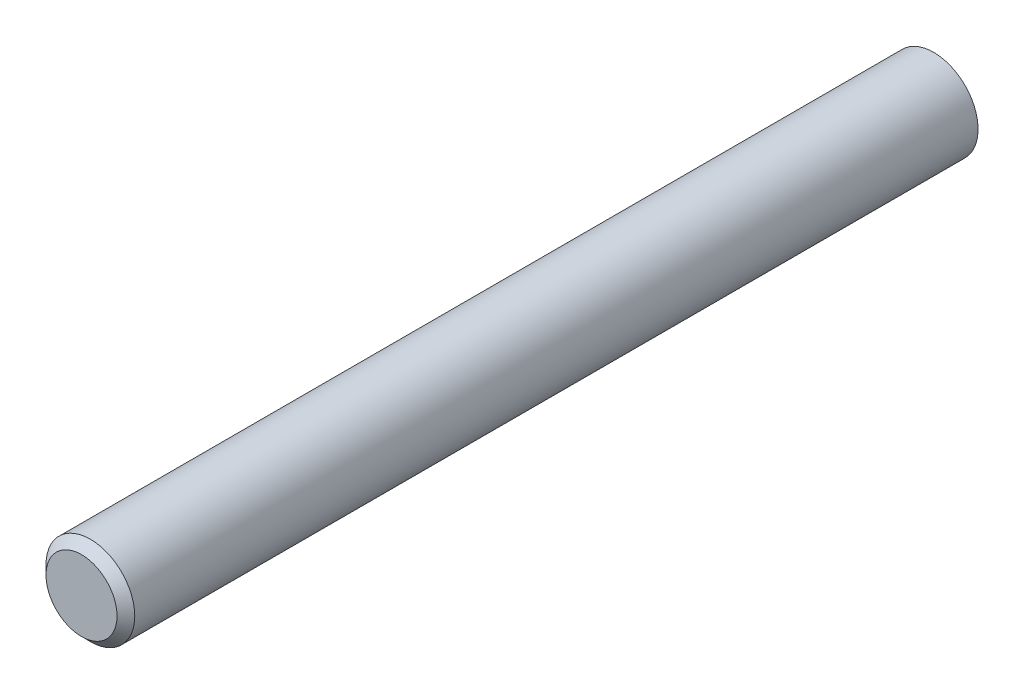
ISO-10303-21;
HEADER;
FILE_DESCRIPTION(('STEP AP214'),'2;1');
FILE_NAME('part.step','',(''),(''),'','','');
FILE_SCHEMA(('AUTOMOTIVE_DESIGN { 1 0 10303 214 1 1 1 1 }'));
ENDSEC;
DATA;
#1=APPLICATION_CONTEXT('core data for automotive mechanical design processes');
#2=APPLICATION_PROTOCOL_DEFINITION('international standard','automotive_design',2000,#1);
#3=PRODUCT_CONTEXT('',#1,'mechanical');
#4=PRODUCT('Part','Part','',(#3));
#5=PRODUCT_RELATED_PRODUCT_CATEGORY('part','',(#4));
#6=PRODUCT_DEFINITION_FORMATION('','',#4);
#7=PRODUCT_DEFINITION_CONTEXT('part definition',#1,'design');
#8=PRODUCT_DEFINITION('design','',#6,#7);
#9=PRODUCT_DEFINITION_SHAPE('','',#8);
#10=(LENGTH_UNIT() NAMED_UNIT(*) SI_UNIT(.MILLI.,.METRE.));
#11=(NAMED_UNIT(*) PLANE_ANGLE_UNIT() SI_UNIT($,.RADIAN.));
#12=(NAMED_UNIT(*) SI_UNIT($,.STERADIAN.) SOLID_ANGLE_UNIT());
#13=UNCERTAINTY_MEASURE_WITH_UNIT(LENGTH_MEASURE(1.E-05),#10,'distance_accuracy_value','');
#14=(GEOMETRIC_REPRESENTATION_CONTEXT(3) GLOBAL_UNCERTAINTY_ASSIGNED_CONTEXT((#13)) GLOBAL_UNIT_ASSIGNED_CONTEXT((#10,
#11,#12)) REPRESENTATION_CONTEXT('',''));
#15=CARTESIAN_POINT('',(0.,0.,0.));
#16=DIRECTION('',(0.,0.,1.));
#17=DIRECTION('',(1.,0.,0.));
#18=AXIS2_PLACEMENT_3D('',#15,#16,#17);
#19=CARTESIAN_POINT('',(0.,0.,50.8));
#20=DIRECTION('',(0.,0.,-1.));
#21=DIRECTION('',(-1.,0.,0.));
#22=AXIS2_PLACEMENT_3D('',#19,#20,#21);
#23=CYLINDRICAL_SURFACE('',#22,3.96875);
#24=CARTESIAN_POINT('',(0.,0.,50.00625));
#25=DIRECTION('',(0.,0.,1.));
#26=DIRECTION('',(1.,0.,0.));
#27=AXIS2_PLACEMENT_3D('',#24,#25,#26);
#28=CIRCLE('',#27,3.96875);
#29=CARTESIAN_POINT('',(3.96875,0.,50.00625));
#30=VERTEX_POINT('',#29);
#31=EDGE_CURVE('E51',#30,#30,#28,.F.);
#32=ORIENTED_EDGE('',*,*,#31,.T.);
#33=EDGE_LOOP('',(#32));
#34=FACE_BOUND('',#33,.T.);
#35=CARTESIAN_POINT('',(0.,0.,-25.4));
#36=DIRECTION('',(0.,0.,-1.));
#37=DIRECTION('',(-1.,0.,0.));
#38=AXIS2_PLACEMENT_3D('',#35,#36,#37);
#39=CIRCLE('',#38,3.96875);
#40=CARTESIAN_POINT('',(-3.96875,0.,-25.4));
#41=VERTEX_POINT('',#40);
#42=EDGE_CURVE('E56',#41,#41,#39,.T.);
#43=ORIENTED_EDGE('',*,*,#42,.F.);
#44=EDGE_LOOP('',(#43));
#45=FACE_BOUND('',#44,.T.);
#46=ADVANCED_FACE('F43',(#34,#45),#23,.T.);
#47=CARTESIAN_POINT('',(0.,0.,50.8));
#48=DIRECTION('',(0.,0.,1.));
#49=DIRECTION('',(1.,0.,0.));
#50=AXIS2_PLACEMENT_3D('',#47,#48,#49);
#51=PLANE('',#50);
#52=CARTESIAN_POINT('',(0.,0.,50.8));
#53=DIRECTION('',(0.,0.,1.));
#54=DIRECTION('',(1.,0.,0.));
#55=AXIS2_PLACEMENT_3D('',#52,#53,#54);
#56=CIRCLE('',#55,3.17499999999998);
#57=CARTESIAN_POINT('',(3.17499999999998,0.,50.8));
#58=VERTEX_POINT('',#57);
#59=EDGE_CURVE('E10',#58,#58,#56,.T.);
#60=ORIENTED_EDGE('',*,*,#59,.T.);
#61=EDGE_LOOP('',(#60));
#62=FACE_BOUND('',#61,.T.);
#63=ADVANCED_FACE('F67',(#62),#51,.T.);
#64=CARTESIAN_POINT('',(0.,0.,50.8));
#65=DIRECTION('',(0.,0.,-1.));
#66=DIRECTION('',(-1.,0.,0.));
#67=AXIS2_PLACEMENT_3D('',#64,#65,#66);
#68=CONICAL_SURFACE('',#67,3.17499999999998,0.78539816339744);
#69=ORIENTED_EDGE('',*,*,#31,.F.);
#70=EDGE_LOOP('',(#69));
#71=FACE_BOUND('',#70,.T.);
#72=ORIENTED_EDGE('',*,*,#59,.F.);
#73=EDGE_LOOP('',(#72));
#74=FACE_BOUND('',#73,.T.);
#75=ADVANCED_FACE('F45',(#71,#74),#68,.T.);
#76=CARTESIAN_POINT('',(0.,0.,-25.4));
#77=DIRECTION('',(0.,0.,-1.));
#78=DIRECTION('',(-1.,0.,0.));
#79=AXIS2_PLACEMENT_3D('',#76,#77,#78);
#80=PLANE('',#79);
#81=ORIENTED_EDGE('',*,*,#42,.T.);
#82=EDGE_LOOP('',(#81));
#83=FACE_BOUND('',#82,.T.);
#84=ADVANCED_FACE('F64',(#83),#80,.T.);
#85=CLOSED_SHELL('',(#46,#63,#75,#84));
#86=MANIFOLD_SOLID_BREP('B2',#85);
#87=ADVANCED_BREP_SHAPE_REPRESENTATION('',(#18,#86),#14);
#88=SHAPE_DEFINITION_REPRESENTATION(#9,#87);
ENDSEC;
END-ISO-10303-21;
